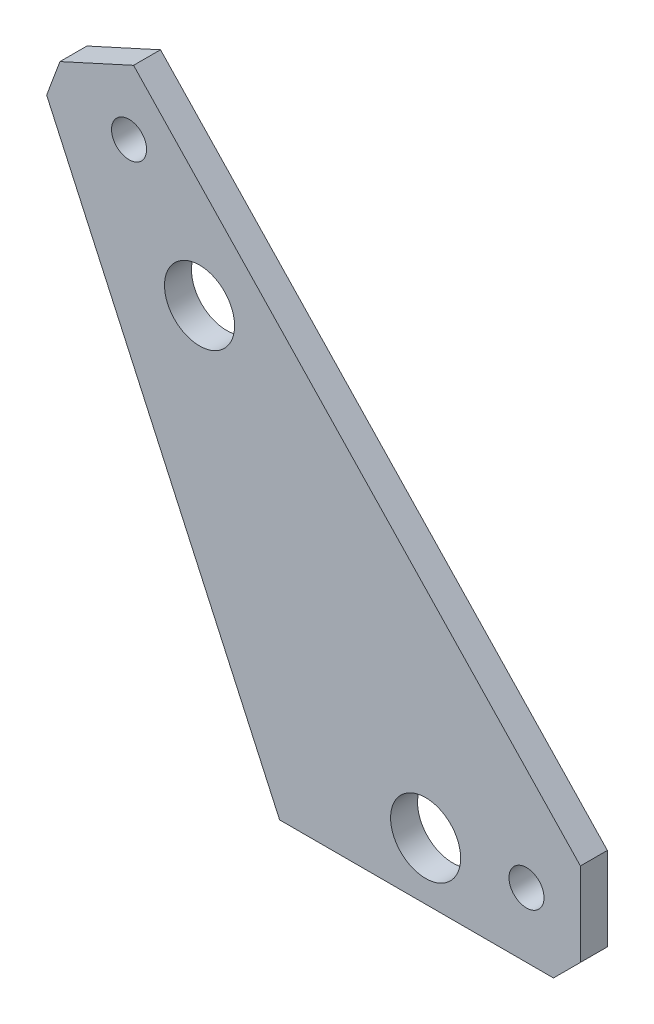
ISO-10303-21;
HEADER;
FILE_DESCRIPTION(('STEP AP214'),'2;1');
FILE_NAME('part.step','',(''),(''),'','','');
FILE_SCHEMA(('AUTOMOTIVE_DESIGN { 1 0 10303 214 1 1 1 1 }'));
ENDSEC;
DATA;
#1=APPLICATION_CONTEXT('core data for automotive mechanical design processes');
#2=APPLICATION_PROTOCOL_DEFINITION('international standard','automotive_design',2000,#1);
#3=PRODUCT_CONTEXT('',#1,'mechanical');
#4=PRODUCT('Part','Part','',(#3));
#5=PRODUCT_RELATED_PRODUCT_CATEGORY('part','',(#4));
#6=PRODUCT_DEFINITION_FORMATION('','',#4);
#7=PRODUCT_DEFINITION_CONTEXT('part definition',#1,'design');
#8=PRODUCT_DEFINITION('design','',#6,#7);
#9=PRODUCT_DEFINITION_SHAPE('','',#8);
#10=(LENGTH_UNIT() NAMED_UNIT(*) SI_UNIT(.MILLI.,.METRE.));
#11=(NAMED_UNIT(*) PLANE_ANGLE_UNIT() SI_UNIT($,.RADIAN.));
#12=(NAMED_UNIT(*) SI_UNIT($,.STERADIAN.) SOLID_ANGLE_UNIT());
#13=UNCERTAINTY_MEASURE_WITH_UNIT(LENGTH_MEASURE(1.E-05),#10,'distance_accuracy_value','');
#14=(GEOMETRIC_REPRESENTATION_CONTEXT(3) GLOBAL_UNCERTAINTY_ASSIGNED_CONTEXT((#13)) GLOBAL_UNIT_ASSIGNED_CONTEXT((#10,
#11,#12)) REPRESENTATION_CONTEXT('',''));
#15=CARTESIAN_POINT('',(0.,0.,0.));
#16=DIRECTION('',(0.,0.,1.));
#17=DIRECTION('',(1.,0.,0.));
#18=AXIS2_PLACEMENT_3D('',#15,#16,#17);
#19=CARTESIAN_POINT('',(103.422242508778,-51.995703565754,10.));
#20=DIRECTION('',(-0.724676695488959,-0.689089026915393,0.));
#21=DIRECTION('',(0.689089026915393,-0.724676695488959,0.));
#22=AXIS2_PLACEMENT_3D('',#19,#20,#21);
#23=PLANE('',#22);
#24=DIRECTION('',(-0.689089026915393,0.724676695488958,0.));
#25=VECTOR('',#24,1.);
#26=CARTESIAN_POINT('',(103.422242508778,-51.995703565754,0.));
#27=LINE('',#26,#25);
#28=CARTESIAN_POINT('',(103.422242508778,-51.995703565754,0.));
#29=VERTEX_POINT('',#28);
#30=CARTESIAN_POINT('',(-62.3637631775543,122.352239974836,0.));
#31=VERTEX_POINT('',#30);
#32=EDGE_CURVE('E129',#29,#31,#27,.T.);
#33=ORIENTED_EDGE('',*,*,#32,.T.);
#34=DIRECTION('',(0.,0.,-1.));
#35=VECTOR('',#34,1.);
#36=CARTESIAN_POINT('',(-62.3637631775543,122.352239974836,10.));
#37=LINE('',#36,#35);
#38=CARTESIAN_POINT('',(-62.3637631775543,122.352239974836,10.));
#39=VERTEX_POINT('',#38);
#40=EDGE_CURVE('E11',#39,#31,#37,.T.);
#41=ORIENTED_EDGE('',*,*,#40,.F.);
#42=DIRECTION('',(-0.689089026915393,0.724676695488958,0.));
#43=VECTOR('',#42,1.);
#44=CARTESIAN_POINT('',(103.422242508778,-51.995703565754,10.));
#45=LINE('',#44,#43);
#46=CARTESIAN_POINT('',(103.422242508778,-51.995703565754,10.));
#47=VERTEX_POINT('',#46);
#48=EDGE_CURVE('E144',#47,#39,#45,.T.);
#49=ORIENTED_EDGE('',*,*,#48,.F.);
#50=DIRECTION('',(0.,0.,-1.));
#51=VECTOR('',#50,1.);
#52=CARTESIAN_POINT('',(103.422242508778,-51.995703565754,10.));
#53=LINE('',#52,#51);
#54=EDGE_CURVE('E125',#47,#29,#53,.T.);
#55=ORIENTED_EDGE('',*,*,#54,.T.);
#56=EDGE_LOOP('',(#33,#41,#49,#55));
#57=FACE_BOUND('',#56,.T.);
#58=ADVANCED_FACE('F33',(#57),#23,.F.);
#59=CARTESIAN_POINT('',(-89.6626013038506,109.911442695148,10.));
#60=DIRECTION('',(0.414693242656249,-0.909961270876539,0.));
#61=DIRECTION('',(0.909961270876539,0.414693242656249,0.));
#62=AXIS2_PLACEMENT_3D('',#59,#60,#61);
#63=PLANE('',#62);
#64=DIRECTION('',(-0.909961270876539,-0.414693242656249,0.));
#65=VECTOR('',#64,1.);
#66=CARTESIAN_POINT('',(-89.6626013038506,109.911442695148,0.));
#67=LINE('',#66,#65);
#68=CARTESIAN_POINT('',(-89.6626013038506,109.911442695148,0.));
#69=VERTEX_POINT('',#68);
#70=EDGE_CURVE('E132',#31,#69,#67,.T.);
#71=ORIENTED_EDGE('',*,*,#70,.T.);
#72=DIRECTION('',(0.,0.,-1.));
#73=VECTOR('',#72,1.);
#74=CARTESIAN_POINT('',(-89.6626013038506,109.911442695148,10.));
#75=LINE('',#74,#73);
#76=CARTESIAN_POINT('',(-89.6626013038506,109.911442695148,10.));
#77=VERTEX_POINT('',#76);
#78=EDGE_CURVE('E41',#77,#69,#75,.T.);
#79=ORIENTED_EDGE('',*,*,#78,.F.);
#80=DIRECTION('',(-0.909961270876539,-0.414693242656249,0.));
#81=VECTOR('',#80,1.);
#82=CARTESIAN_POINT('',(-89.6626013038506,109.911442695148,10.));
#83=LINE('',#82,#81);
#84=EDGE_CURVE('E92',#39,#77,#83,.T.);
#85=ORIENTED_EDGE('',*,*,#84,.F.);
#86=ORIENTED_EDGE('',*,*,#40,.T.);
#87=EDGE_LOOP('',(#71,#79,#85,#86));
#88=FACE_BOUND('',#87,.T.);
#89=ADVANCED_FACE('F234',(#88),#63,.F.);
#90=CARTESIAN_POINT('',(-94.6152815860535,96.6648975598205,10.));
#91=DIRECTION('',(0.936672189248401,-0.350207381259458,0.));
#92=DIRECTION('',(0.350207381259458,0.936672189248401,0.));
#93=AXIS2_PLACEMENT_3D('',#90,#91,#92);
#94=PLANE('',#93);
#95=DIRECTION('',(-0.350207381259458,-0.936672189248401,0.));
#96=VECTOR('',#95,1.);
#97=CARTESIAN_POINT('',(-94.6152815860535,96.6648975598205,0.));
#98=LINE('',#97,#96);
#99=CARTESIAN_POINT('',(-94.6152815860535,96.6648975598205,0.));
#100=VERTEX_POINT('',#99);
#101=EDGE_CURVE('E135',#69,#100,#98,.T.);
#102=ORIENTED_EDGE('',*,*,#101,.T.);
#103=DIRECTION('',(0.,0.,-1.));
#104=VECTOR('',#103,1.);
#105=CARTESIAN_POINT('',(-94.6152815860535,96.6648975598205,10.));
#106=LINE('',#105,#104);
#107=CARTESIAN_POINT('',(-94.6152815860535,96.6648975598205,10.));
#108=VERTEX_POINT('',#107);
#109=EDGE_CURVE('E151',#108,#100,#106,.T.);
#110=ORIENTED_EDGE('',*,*,#109,.F.);
#111=DIRECTION('',(-0.350207381259458,-0.936672189248401,0.));
#112=VECTOR('',#111,1.);
#113=CARTESIAN_POINT('',(-94.6152815860535,96.6648975598205,10.));
#114=LINE('',#113,#112);
#115=EDGE_CURVE('E159',#77,#108,#114,.T.);
#116=ORIENTED_EDGE('',*,*,#115,.F.);
#117=ORIENTED_EDGE('',*,*,#78,.T.);
#118=EDGE_LOOP('',(#102,#110,#116,#117));
#119=FACE_BOUND('',#118,.T.);
#120=ADVANCED_FACE('F157',(#119),#94,.F.);
#121=CARTESIAN_POINT('',(-8.2353139444066,-92.8786422142856,10.));
#122=DIRECTION('',(0.90996127087654,0.414693242656247,0.));
#123=DIRECTION('',(-0.414693242656247,0.90996127087654,0.));
#124=AXIS2_PLACEMENT_3D('',#121,#122,#123);
#125=PLANE('',#124);
#126=DIRECTION('',(0.414693242656247,-0.90996127087654,0.));
#127=VECTOR('',#126,1.);
#128=CARTESIAN_POINT('',(-8.2353139444066,-92.8786422142856,0.));
#129=LINE('',#128,#127);
#130=CARTESIAN_POINT('',(-8.23531394440659,-92.8786422142856,0.));
#131=VERTEX_POINT('',#130);
#132=EDGE_CURVE('E137',#100,#131,#129,.T.);
#133=ORIENTED_EDGE('',*,*,#132,.T.);
#134=DIRECTION('',(0.,0.,-1.));
#135=VECTOR('',#134,1.);
#136=CARTESIAN_POINT('',(-8.23531394440659,-92.8786422142856,10.));
#137=LINE('',#136,#135);
#138=CARTESIAN_POINT('',(-8.23531394440659,-92.8786422142856,10.));
#139=VERTEX_POINT('',#138);
#140=EDGE_CURVE('E148',#139,#131,#137,.T.);
#141=ORIENTED_EDGE('',*,*,#140,.F.);
#142=DIRECTION('',(0.414693242656247,-0.90996127087654,0.));
#143=VECTOR('',#142,1.);
#144=CARTESIAN_POINT('',(-8.2353139444066,-92.8786422142856,10.));
#145=LINE('',#144,#143);
#146=EDGE_CURVE('E171',#108,#139,#145,.T.);
#147=ORIENTED_EDGE('',*,*,#146,.F.);
#148=ORIENTED_EDGE('',*,*,#109,.T.);
#149=EDGE_LOOP('',(#133,#141,#147,#148));
#150=FACE_BOUND('',#149,.T.);
#151=ADVANCED_FACE('F167',(#150),#125,.F.);
#152=CARTESIAN_POINT('',(-8.05332169023129,-92.7957035657544,10.));
#153=DIRECTION('',(0.,0.,-1.));
#154=DIRECTION('',(-1.,0.,0.));
#155=AXIS2_PLACEMENT_3D('',#152,#153,#154);
#156=CYLINDRICAL_SURFACE('',#155,0.199999999999987);
#157=CARTESIAN_POINT('',(-8.05332169023129,-92.7957035657544,0.));
#158=DIRECTION('',(0.,0.,1.));
#159=DIRECTION('',(1.,0.,0.));
#160=AXIS2_PLACEMENT_3D('',#157,#158,#159);
#161=CIRCLE('',#160,0.199999999999987);
#162=CARTESIAN_POINT('',(-8.05332169023129,-92.9957035657543,0.));
#163=VERTEX_POINT('',#162);
#164=EDGE_CURVE('E139',#131,#163,#161,.T.);
#165=ORIENTED_EDGE('',*,*,#164,.T.);
#166=DIRECTION('',(0.,0.,-1.));
#167=VECTOR('',#166,1.);
#168=CARTESIAN_POINT('',(-8.05332169023129,-92.9957035657543,10.));
#169=LINE('',#168,#167);
#170=CARTESIAN_POINT('',(-8.05332169023129,-92.9957035657543,10.));
#171=VERTEX_POINT('',#170);
#172=EDGE_CURVE('E120',#171,#163,#169,.T.);
#173=ORIENTED_EDGE('',*,*,#172,.F.);
#174=CARTESIAN_POINT('',(-8.05332169023129,-92.7957035657544,10.));
#175=DIRECTION('',(0.,0.,1.));
#176=DIRECTION('',(1.,0.,0.));
#177=AXIS2_PLACEMENT_3D('',#174,#175,#176);
#178=CIRCLE('',#177,0.199999999999987);
#179=EDGE_CURVE('E111',#139,#171,#178,.T.);
#180=ORIENTED_EDGE('',*,*,#179,.F.);
#181=ORIENTED_EDGE('',*,*,#140,.T.);
#182=EDGE_LOOP('',(#165,#173,#180,#181));
#183=FACE_BOUND('',#182,.T.);
#184=ADVANCED_FACE('F170',(#183),#156,.T.);
#185=CARTESIAN_POINT('',(93.4222425087781,-92.9957035657542,10.));
#186=DIRECTION('',(0.,1.,0.));
#187=DIRECTION('',(-1.,0.,0.));
#188=AXIS2_PLACEMENT_3D('',#185,#186,#187);
#189=PLANE('',#188);
#190=DIRECTION('',(1.,0.,0.));
#191=VECTOR('',#190,1.);
#192=CARTESIAN_POINT('',(93.4222425087781,-92.9957035657542,0.));
#193=LINE('',#192,#191);
#194=CARTESIAN_POINT('',(93.4222425087781,-92.9957035657542,0.));
#195=VERTEX_POINT('',#194);
#196=EDGE_CURVE('E119',#163,#195,#193,.T.);
#197=ORIENTED_EDGE('',*,*,#196,.T.);
#198=DIRECTION('',(0.,0.,-1.));
#199=VECTOR('',#198,1.);
#200=CARTESIAN_POINT('',(93.4222425087781,-92.9957035657542,10.));
#201=LINE('',#200,#199);
#202=CARTESIAN_POINT('',(93.4222425087781,-92.9957035657542,10.));
#203=VERTEX_POINT('',#202);
#204=EDGE_CURVE('E116',#203,#195,#201,.T.);
#205=ORIENTED_EDGE('',*,*,#204,.F.);
#206=DIRECTION('',(1.,0.,0.));
#207=VECTOR('',#206,1.);
#208=CARTESIAN_POINT('',(93.4222425087781,-92.9957035657542,10.));
#209=LINE('',#208,#207);
#210=EDGE_CURVE('E105',#171,#203,#209,.T.);
#211=ORIENTED_EDGE('',*,*,#210,.F.);
#212=ORIENTED_EDGE('',*,*,#172,.T.);
#213=EDGE_LOOP('',(#197,#205,#211,#212));
#214=FACE_BOUND('',#213,.T.);
#215=ADVANCED_FACE('F117',(#214),#189,.F.);
#216=CARTESIAN_POINT('',(103.422242508778,-82.9957035657541,10.));
#217=DIRECTION('',(-0.707106781186548,0.707106781186546,0.));
#218=DIRECTION('',(-0.707106781186547,-0.707106781186549,0.));
#219=AXIS2_PLACEMENT_3D('',#216,#217,#218);
#220=PLANE('',#219);
#221=DIRECTION('',(0.707106781186546,0.707106781186548,0.));
#222=VECTOR('',#221,1.);
#223=CARTESIAN_POINT('',(103.422242508778,-82.9957035657541,0.));
#224=LINE('',#223,#222);
#225=CARTESIAN_POINT('',(103.422242508778,-82.9957035657541,0.));
#226=VERTEX_POINT('',#225);
#227=EDGE_CURVE('E78',#195,#226,#224,.T.);
#228=ORIENTED_EDGE('',*,*,#227,.T.);
#229=DIRECTION('',(0.,0.,-1.));
#230=VECTOR('',#229,1.);
#231=CARTESIAN_POINT('',(103.422242508778,-82.9957035657541,10.));
#232=LINE('',#231,#230);
#233=CARTESIAN_POINT('',(103.422242508778,-82.9957035657541,10.));
#234=VERTEX_POINT('',#233);
#235=EDGE_CURVE('E121',#234,#226,#232,.T.);
#236=ORIENTED_EDGE('',*,*,#235,.F.);
#237=DIRECTION('',(0.707106781186546,0.707106781186548,0.));
#238=VECTOR('',#237,1.);
#239=CARTESIAN_POINT('',(103.422242508778,-82.9957035657541,10.));
#240=LINE('',#239,#238);
#241=EDGE_CURVE('E109',#203,#234,#240,.T.);
#242=ORIENTED_EDGE('',*,*,#241,.F.);
#243=ORIENTED_EDGE('',*,*,#204,.T.);
#244=EDGE_LOOP('',(#228,#236,#242,#243));
#245=FACE_BOUND('',#244,.T.);
#246=ADVANCED_FACE('F123',(#245),#220,.F.);
#247=CARTESIAN_POINT('',(103.422242508778,-51.995703565754,10.));
#248=DIRECTION('',(-1.,0.,0.));
#249=DIRECTION('',(0.,0.,1.));
#250=AXIS2_PLACEMENT_3D('',#247,#248,#249);
#251=PLANE('',#250);
#252=DIRECTION('',(0.,1.,0.));
#253=VECTOR('',#252,1.);
#254=CARTESIAN_POINT('',(103.422242508778,-51.995703565754,0.));
#255=LINE('',#254,#253);
#256=EDGE_CURVE('E84',#226,#29,#255,.T.);
#257=ORIENTED_EDGE('',*,*,#256,.T.);
#258=ORIENTED_EDGE('',*,*,#54,.F.);
#259=DIRECTION('',(0.,1.,0.));
#260=VECTOR('',#259,1.);
#261=CARTESIAN_POINT('',(103.422242508778,-51.995703565754,10.));
#262=LINE('',#261,#260);
#263=EDGE_CURVE('E49',#234,#47,#262,.T.);
#264=ORIENTED_EDGE('',*,*,#263,.F.);
#265=ORIENTED_EDGE('',*,*,#235,.T.);
#266=EDGE_LOOP('',(#257,#258,#264,#265));
#267=FACE_BOUND('',#266,.T.);
#268=ADVANCED_FACE('F212',(#267),#251,.F.);
#269=CARTESIAN_POINT('',(-8.05332169023129,-92.7957035657544,10.));
#270=DIRECTION('',(0.,0.,1.));
#271=DIRECTION('',(1.,0.,0.));
#272=AXIS2_PLACEMENT_3D('',#269,#270,#271);
#273=PLANE('',#272);
#274=CARTESIAN_POINT('',(83.4222425087781,-68.9957035657544,10.));
#275=DIRECTION('',(0.,0.,1.));
#276=DIRECTION('',(1.,0.,0.));
#277=AXIS2_PLACEMENT_3D('',#274,#275,#276);
#278=CIRCLE('',#277,6.5);
#279=CARTESIAN_POINT('',(89.9222425087781,-68.9957035657544,10.));
#280=VERTEX_POINT('',#279);
#281=EDGE_CURVE('E195',#280,#280,#278,.T.);
#282=ORIENTED_EDGE('',*,*,#281,.F.);
#283=EDGE_LOOP('',(#282));
#284=FACE_BOUND('',#283,.T.);
#285=CARTESIAN_POINT('',(-64.0311234703719,97.6810888401928,10.));
#286=DIRECTION('',(0.,0.,1.));
#287=DIRECTION('',(1.,0.,0.));
#288=AXIS2_PLACEMENT_3D('',#285,#286,#287);
#289=CIRCLE('',#288,6.50000000000001);
#290=CARTESIAN_POINT('',(-57.5311234703719,97.6810888401928,10.));
#291=VERTEX_POINT('',#290);
#292=EDGE_CURVE('E189',#291,#291,#289,.T.);
#293=ORIENTED_EDGE('',*,*,#292,.F.);
#294=EDGE_LOOP('',(#293));
#295=FACE_BOUND('',#294,.T.);
#296=CARTESIAN_POINT('',(-37.8884497896507,57.4249015788124,10.));
#297=DIRECTION('',(0.,0.,1.));
#298=DIRECTION('',(1.,0.,0.));
#299=AXIS2_PLACEMENT_3D('',#296,#297,#298);
#300=CIRCLE('',#299,13.);
#301=CARTESIAN_POINT('',(-24.8884497896507,57.4249015788124,10.));
#302=VERTEX_POINT('',#301);
#303=EDGE_CURVE('E183',#302,#302,#300,.T.);
#304=ORIENTED_EDGE('',*,*,#303,.F.);
#305=EDGE_LOOP('',(#304));
#306=FACE_BOUND('',#305,.T.);
#307=CARTESIAN_POINT('',(45.9859616026632,-71.7303658847831,10.));
#308=DIRECTION('',(0.,0.,1.));
#309=DIRECTION('',(1.,0.,0.));
#310=AXIS2_PLACEMENT_3D('',#307,#308,#309);
#311=CIRCLE('',#310,13.);
#312=CARTESIAN_POINT('',(58.9859616026632,-71.7303658847831,10.));
#313=VERTEX_POINT('',#312);
#314=EDGE_CURVE('E177',#313,#313,#311,.T.);
#315=ORIENTED_EDGE('',*,*,#314,.F.);
#316=EDGE_LOOP('',(#315));
#317=FACE_BOUND('',#316,.T.);
#318=ORIENTED_EDGE('',*,*,#48,.T.);
#319=ORIENTED_EDGE('',*,*,#84,.T.);
#320=ORIENTED_EDGE('',*,*,#115,.T.);
#321=ORIENTED_EDGE('',*,*,#146,.T.);
#322=ORIENTED_EDGE('',*,*,#179,.T.);
#323=ORIENTED_EDGE('',*,*,#210,.T.);
#324=ORIENTED_EDGE('',*,*,#241,.T.);
#325=ORIENTED_EDGE('',*,*,#263,.T.);
#326=EDGE_LOOP('',(#318,#319,#320,#321,#322,#323,#324,#325));
#327=FACE_BOUND('',#326,.T.);
#328=ADVANCED_FACE('F107',(#284,#295,#306,#317,#327),#273,.T.);
#329=CARTESIAN_POINT('',(-8.05332169023129,-92.7957035657544,0.));
#330=DIRECTION('',(0.,0.,1.));
#331=DIRECTION('',(1.,0.,0.));
#332=AXIS2_PLACEMENT_3D('',#329,#330,#331);
#333=PLANE('',#332);
#334=CARTESIAN_POINT('',(83.4222425087781,-68.9957035657544,0.));
#335=DIRECTION('',(0.,0.,1.));
#336=DIRECTION('',(1.,0.,0.));
#337=AXIS2_PLACEMENT_3D('',#334,#335,#336);
#338=CIRCLE('',#337,6.5);
#339=CARTESIAN_POINT('',(89.9222425087781,-68.9957035657544,0.));
#340=VERTEX_POINT('',#339);
#341=EDGE_CURVE('E133',#340,#340,#338,.T.);
#342=ORIENTED_EDGE('',*,*,#341,.T.);
#343=EDGE_LOOP('',(#342));
#344=FACE_BOUND('',#343,.T.);
#345=CARTESIAN_POINT('',(-64.0311234703719,97.6810888401928,0.));
#346=DIRECTION('',(0.,0.,1.));
#347=DIRECTION('',(1.,0.,0.));
#348=AXIS2_PLACEMENT_3D('',#345,#346,#347);
#349=CIRCLE('',#348,6.50000000000001);
#350=CARTESIAN_POINT('',(-57.5311234703719,97.6810888401928,0.));
#351=VERTEX_POINT('',#350);
#352=EDGE_CURVE('E192',#351,#351,#349,.T.);
#353=ORIENTED_EDGE('',*,*,#352,.T.);
#354=EDGE_LOOP('',(#353));
#355=FACE_BOUND('',#354,.T.);
#356=CARTESIAN_POINT('',(-37.8884497896507,57.4249015788124,0.));
#357=DIRECTION('',(0.,0.,1.));
#358=DIRECTION('',(1.,0.,0.));
#359=AXIS2_PLACEMENT_3D('',#356,#357,#358);
#360=CIRCLE('',#359,13.);
#361=CARTESIAN_POINT('',(-24.8884497896507,57.4249015788124,0.));
#362=VERTEX_POINT('',#361);
#363=EDGE_CURVE('E186',#362,#362,#360,.T.);
#364=ORIENTED_EDGE('',*,*,#363,.T.);
#365=EDGE_LOOP('',(#364));
#366=FACE_BOUND('',#365,.T.);
#367=CARTESIAN_POINT('',(45.9859616026632,-71.7303658847831,0.));
#368=DIRECTION('',(0.,0.,1.));
#369=DIRECTION('',(1.,0.,0.));
#370=AXIS2_PLACEMENT_3D('',#367,#368,#369);
#371=CIRCLE('',#370,13.);
#372=CARTESIAN_POINT('',(58.9859616026632,-71.7303658847831,0.));
#373=VERTEX_POINT('',#372);
#374=EDGE_CURVE('E180',#373,#373,#371,.T.);
#375=ORIENTED_EDGE('',*,*,#374,.T.);
#376=EDGE_LOOP('',(#375));
#377=FACE_BOUND('',#376,.T.);
#378=ORIENTED_EDGE('',*,*,#32,.F.);
#379=ORIENTED_EDGE('',*,*,#256,.F.);
#380=ORIENTED_EDGE('',*,*,#227,.F.);
#381=ORIENTED_EDGE('',*,*,#196,.F.);
#382=ORIENTED_EDGE('',*,*,#164,.F.);
#383=ORIENTED_EDGE('',*,*,#132,.F.);
#384=ORIENTED_EDGE('',*,*,#101,.F.);
#385=ORIENTED_EDGE('',*,*,#70,.F.);
#386=EDGE_LOOP('',(#378,#379,#380,#381,#382,#383,#384,#385));
#387=FACE_BOUND('',#386,.T.);
#388=ADVANCED_FACE('F163',(#344,#355,#366,#377,#387),#333,.F.);
#389=CARTESIAN_POINT('',(45.9859616026632,-71.7303658847831,0.));
#390=DIRECTION('',(0.,0.,1.));
#391=DIRECTION('',(1.,0.,0.));
#392=AXIS2_PLACEMENT_3D('',#389,#390,#391);
#393=CYLINDRICAL_SURFACE('',#392,13.);
#394=ORIENTED_EDGE('',*,*,#374,.F.);
#395=EDGE_LOOP('',(#394));
#396=FACE_BOUND('',#395,.T.);
#397=ORIENTED_EDGE('',*,*,#314,.T.);
#398=EDGE_LOOP('',(#397));
#399=FACE_BOUND('',#398,.T.);
#400=ADVANCED_FACE('F220',(#396,#399),#393,.F.);
#401=CARTESIAN_POINT('',(-37.8884497896507,57.4249015788124,0.));
#402=DIRECTION('',(0.,0.,1.));
#403=DIRECTION('',(1.,0.,0.));
#404=AXIS2_PLACEMENT_3D('',#401,#402,#403);
#405=CYLINDRICAL_SURFACE('',#404,13.);
#406=ORIENTED_EDGE('',*,*,#363,.F.);
#407=EDGE_LOOP('',(#406));
#408=FACE_BOUND('',#407,.T.);
#409=ORIENTED_EDGE('',*,*,#303,.T.);
#410=EDGE_LOOP('',(#409));
#411=FACE_BOUND('',#410,.T.);
#412=ADVANCED_FACE('F222',(#408,#411),#405,.F.);
#413=CARTESIAN_POINT('',(-64.0311234703719,97.6810888401928,0.));
#414=DIRECTION('',(0.,0.,1.));
#415=DIRECTION('',(1.,0.,0.));
#416=AXIS2_PLACEMENT_3D('',#413,#414,#415);
#417=CYLINDRICAL_SURFACE('',#416,6.50000000000001);
#418=ORIENTED_EDGE('',*,*,#352,.F.);
#419=EDGE_LOOP('',(#418));
#420=FACE_BOUND('',#419,.T.);
#421=ORIENTED_EDGE('',*,*,#292,.T.);
#422=EDGE_LOOP('',(#421));
#423=FACE_BOUND('',#422,.T.);
#424=ADVANCED_FACE('F206',(#420,#423),#417,.F.);
#425=CARTESIAN_POINT('',(83.4222425087781,-68.9957035657544,0.));
#426=DIRECTION('',(0.,0.,1.));
#427=DIRECTION('',(1.,0.,0.));
#428=AXIS2_PLACEMENT_3D('',#425,#426,#427);
#429=CYLINDRICAL_SURFACE('',#428,6.5);
#430=ORIENTED_EDGE('',*,*,#341,.F.);
#431=EDGE_LOOP('',(#430));
#432=FACE_BOUND('',#431,.T.);
#433=ORIENTED_EDGE('',*,*,#281,.T.);
#434=EDGE_LOOP('',(#433));
#435=FACE_BOUND('',#434,.T.);
#436=ADVANCED_FACE('F203',(#432,#435),#429,.F.);
#437=CLOSED_SHELL('',(#58,#89,#120,#151,#184,#215,#246,#268,#328,#388,#400,#412,#424,#436));
#438=MANIFOLD_SOLID_BREP('B2',#437);
#439=ADVANCED_BREP_SHAPE_REPRESENTATION('',(#18,#438),#14);
#440=SHAPE_DEFINITION_REPRESENTATION(#9,#439);
ENDSEC;
END-ISO-10303-21;
